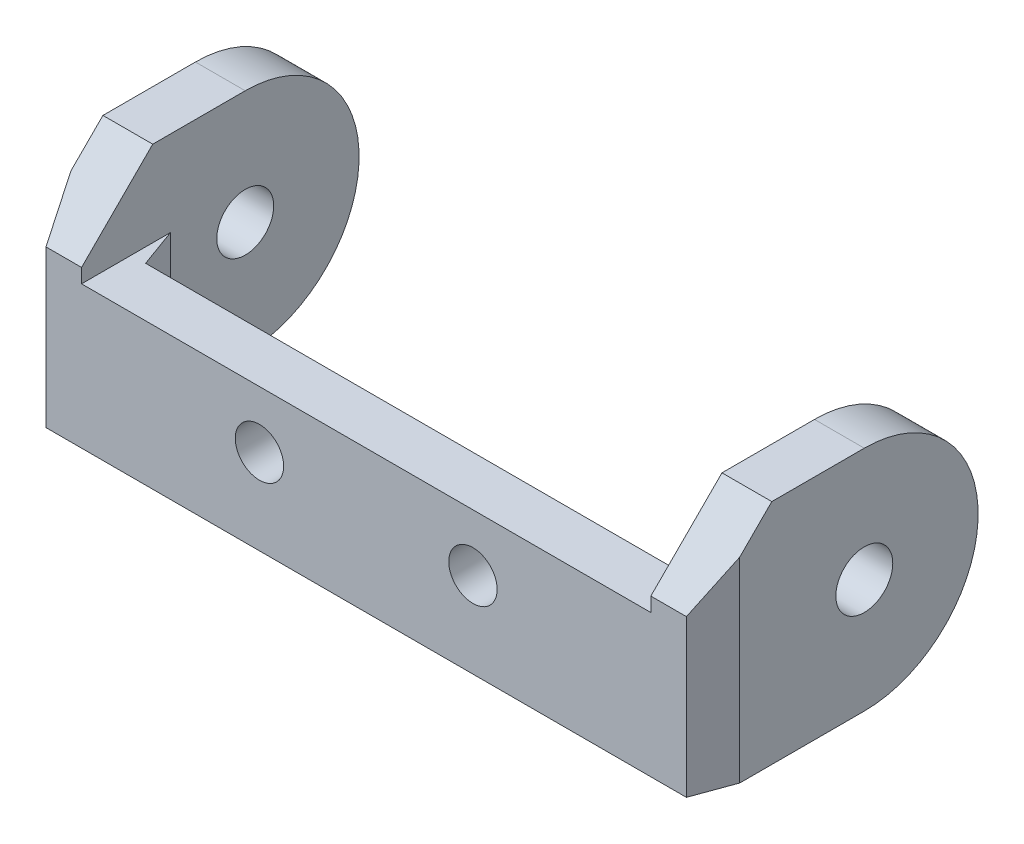
ISO-10303-21;
HEADER;
FILE_DESCRIPTION(('STEP AP214'),'2;1');
FILE_NAME('part.step','',(''),(''),'','','');
FILE_SCHEMA(('AUTOMOTIVE_DESIGN { 1 0 10303 214 1 1 1 1 }'));
ENDSEC;
DATA;
#1=APPLICATION_CONTEXT('core data for automotive mechanical design processes');
#2=APPLICATION_PROTOCOL_DEFINITION('international standard','automotive_design',2000,#1);
#3=PRODUCT_CONTEXT('',#1,'mechanical');
#4=PRODUCT('Part','Part','',(#3));
#5=PRODUCT_RELATED_PRODUCT_CATEGORY('part','',(#4));
#6=PRODUCT_DEFINITION_FORMATION('','',#4);
#7=PRODUCT_DEFINITION_CONTEXT('part definition',#1,'design');
#8=PRODUCT_DEFINITION('design','',#6,#7);
#9=PRODUCT_DEFINITION_SHAPE('','',#8);
#10=(LENGTH_UNIT() NAMED_UNIT(*) SI_UNIT(.MILLI.,.METRE.));
#11=(NAMED_UNIT(*) PLANE_ANGLE_UNIT() SI_UNIT($,.RADIAN.));
#12=(NAMED_UNIT(*) SI_UNIT($,.STERADIAN.) SOLID_ANGLE_UNIT());
#13=UNCERTAINTY_MEASURE_WITH_UNIT(LENGTH_MEASURE(1.E-05),#10,'distance_accuracy_value','');
#14=(GEOMETRIC_REPRESENTATION_CONTEXT(3) GLOBAL_UNCERTAINTY_ASSIGNED_CONTEXT((#13)) GLOBAL_UNIT_ASSIGNED_CONTEXT((#10,
#11,#12)) REPRESENTATION_CONTEXT('',''));
#15=CARTESIAN_POINT('',(0.,0.,0.));
#16=DIRECTION('',(0.,0.,1.));
#17=DIRECTION('',(1.,0.,0.));
#18=AXIS2_PLACEMENT_3D('',#15,#16,#17);
#19=CARTESIAN_POINT('',(27.5,1.00000000000001,3.5));
#20=DIRECTION('',(0.,-1.,0.));
#21=DIRECTION('',(1.,0.,0.));
#22=AXIS2_PLACEMENT_3D('',#19,#20,#21);
#23=PLANE('',#22);
#24=DIRECTION('',(0.,0.,1.));
#25=VECTOR('',#24,1.);
#26=CARTESIAN_POINT('',(24.,1.00000000000001,-8.));
#27=LINE('',#26,#25);
#28=CARTESIAN_POINT('',(24.,1.00000000000001,-8.));
#29=VERTEX_POINT('',#28);
#30=CARTESIAN_POINT('',(24.,1.00000000000001,-1.50000000000002));
#31=VERTEX_POINT('',#30);
#32=EDGE_CURVE('E220',#29,#31,#27,.T.);
#33=ORIENTED_EDGE('',*,*,#32,.T.);
#34=DIRECTION('',(1.,0.,0.));
#35=VECTOR('',#34,1.);
#36=CARTESIAN_POINT('',(26.5,1.00000000000001,-1.50000000000002));
#37=LINE('',#36,#35);
#38=CARTESIAN_POINT('',(27.5,1.00000000000001,-1.50000000000002));
#39=VERTEX_POINT('',#38);
#40=EDGE_CURVE('E289',#31,#39,#37,.T.);
#41=ORIENTED_EDGE('',*,*,#40,.T.);
#42=DIRECTION('',(0.,0.,-1.));
#43=VECTOR('',#42,1.);
#44=CARTESIAN_POINT('',(27.5,1.00000000000001,3.5));
#45=LINE('',#44,#43);
#46=CARTESIAN_POINT('',(27.5,1.00000000000001,-8.));
#47=VERTEX_POINT('',#46);
#48=EDGE_CURVE('E244',#39,#47,#45,.T.);
#49=ORIENTED_EDGE('',*,*,#48,.T.);
#50=DIRECTION('',(1.,0.,0.));
#51=VECTOR('',#50,1.);
#52=CARTESIAN_POINT('',(24.,1.00000000000001,-8.));
#53=LINE('',#52,#51);
#54=EDGE_CURVE('E231',#29,#47,#53,.T.);
#55=ORIENTED_EDGE('',*,*,#54,.F.);
#56=EDGE_LOOP('',(#33,#41,#49,#55));
#57=FACE_BOUND('',#56,.T.);
#58=ADVANCED_FACE('F34',(#57),#23,.F.);
#59=CARTESIAN_POINT('',(-19.5,-15.,3.5));
#60=DIRECTION('',(1.,0.,0.));
#61=DIRECTION('',(0.,0.,-1.));
#62=AXIS2_PLACEMENT_3D('',#59,#60,#61);
#63=PLANE('',#62);
#64=DIRECTION('',(0.,1.,0.));
#65=VECTOR('',#64,1.);
#66=CARTESIAN_POINT('',(-19.5,1.,0.752522580545379));
#67=LINE('',#66,#65);
#68=CARTESIAN_POINT('',(-19.5,-15.,0.752522580545379));
#69=VERTEX_POINT('',#68);
#70=CARTESIAN_POINT('',(-19.5,-1.25252258054538,0.752522580545379));
#71=VERTEX_POINT('',#70);
#72=EDGE_CURVE('E262',#69,#71,#67,.T.);
#73=ORIENTED_EDGE('',*,*,#72,.T.);
#74=DIRECTION('',(0.,0.707106781186547,-0.707106781186549));
#75=VECTOR('',#74,1.);
#76=CARTESIAN_POINT('',(-19.5,-3.99999999999999,3.5));
#77=LINE('',#76,#75);
#78=CARTESIAN_POINT('',(-19.5,1.,-1.50000000000001));
#79=VERTEX_POINT('',#78);
#80=EDGE_CURVE('E57',#71,#79,#77,.T.);
#81=ORIENTED_EDGE('',*,*,#80,.T.);
#82=DIRECTION('',(0.,0.,-1.));
#83=VECTOR('',#82,1.);
#84=CARTESIAN_POINT('',(-19.5,1.,3.5));
#85=LINE('',#84,#83);
#86=CARTESIAN_POINT('',(-19.5,1.00000000000001,-8.));
#87=VERTEX_POINT('',#86);
#88=EDGE_CURVE('E240',#79,#87,#85,.T.);
#89=ORIENTED_EDGE('',*,*,#88,.T.);
#90=CARTESIAN_POINT('',(-19.5,-6.99999999999999,-8.));
#91=DIRECTION('',(1.,0.,0.));
#92=DIRECTION('',(0.,0.,1.));
#93=AXIS2_PLACEMENT_3D('',#90,#91,#92);
#94=CIRCLE('',#93,8.);
#95=CARTESIAN_POINT('',(-19.5,-15.,-8.));
#96=VERTEX_POINT('',#95);
#97=EDGE_CURVE('E194',#96,#87,#94,.T.);
#98=ORIENTED_EDGE('',*,*,#97,.F.);
#99=DIRECTION('',(0.,0.,-1.));
#100=VECTOR('',#99,1.);
#101=CARTESIAN_POINT('',(-19.5,-15.,3.5));
#102=LINE('',#101,#100);
#103=EDGE_CURVE('E248',#69,#96,#102,.T.);
#104=ORIENTED_EDGE('',*,*,#103,.F.);
#105=EDGE_LOOP('',(#73,#81,#89,#98,#104));
#106=FACE_BOUND('',#105,.T.);
#107=CARTESIAN_POINT('',(-19.5,-6.99999999999999,-8.));
#108=DIRECTION('',(1.,0.,0.));
#109=DIRECTION('',(0.,0.,-1.));
#110=AXIS2_PLACEMENT_3D('',#107,#108,#109);
#111=CIRCLE('',#110,2.);
#112=CARTESIAN_POINT('',(-19.5,-6.99999999999999,-10.));
#113=VERTEX_POINT('',#112);
#114=EDGE_CURVE('E195',#113,#113,#111,.T.);
#115=ORIENTED_EDGE('',*,*,#114,.T.);
#116=EDGE_LOOP('',(#115));
#117=FACE_BOUND('',#116,.T.);
#118=ADVANCED_FACE('F304',(#106,#117),#63,.F.);
#119=CARTESIAN_POINT('',(27.5,-15.,3.5));
#120=DIRECTION('',(0.,1.,0.));
#121=DIRECTION('',(-1.,0.,0.));
#122=AXIS2_PLACEMENT_3D('',#119,#120,#121);
#123=PLANE('',#122);
#124=DIRECTION('',(1.,0.,0.));
#125=VECTOR('',#124,1.);
#126=CARTESIAN_POINT('',(27.5,-15.,3.5));
#127=LINE('',#126,#125);
#128=CARTESIAN_POINT('',(-18.5,-15.,3.5));
#129=VERTEX_POINT('',#128);
#130=CARTESIAN_POINT('',(26.5,-15.,3.5));
#131=VERTEX_POINT('',#130);
#132=EDGE_CURVE('E237',#129,#131,#127,.T.);
#133=ORIENTED_EDGE('',*,*,#132,.F.);
#134=DIRECTION('',(-0.34202014332567,0.,-0.939692620785908));
#135=VECTOR('',#134,1.);
#136=CARTESIAN_POINT('',(-18.5,-15.,3.5));
#137=LINE('',#136,#135);
#138=EDGE_CURVE('E260',#129,#69,#137,.T.);
#139=ORIENTED_EDGE('',*,*,#138,.T.);
#140=ORIENTED_EDGE('',*,*,#103,.T.);
#141=DIRECTION('',(-1.,0.,0.));
#142=VECTOR('',#141,1.);
#143=CARTESIAN_POINT('',(-16.,-15.,-8.));
#144=LINE('',#143,#142);
#145=CARTESIAN_POINT('',(-16.,-15.,-8.));
#146=VERTEX_POINT('',#145);
#147=EDGE_CURVE('E208',#146,#96,#144,.T.);
#148=ORIENTED_EDGE('',*,*,#147,.F.);
#149=DIRECTION('',(0.,0.,-1.));
#150=VECTOR('',#149,1.);
#151=CARTESIAN_POINT('',(-16.,-15.,0.));
#152=LINE('',#151,#150);
#153=CARTESIAN_POINT('',(-16.,-15.,-2.74747741945467));
#154=VERTEX_POINT('',#153);
#155=EDGE_CURVE('E203',#154,#146,#152,.T.);
#156=ORIENTED_EDGE('',*,*,#155,.F.);
#157=DIRECTION('',(0.342020143325663,0.,0.939692620785911));
#158=VECTOR('',#157,1.);
#159=CARTESIAN_POINT('',(-8.90356609932702,-15.,16.749814481297));
#160=LINE('',#159,#158);
#161=CARTESIAN_POINT('',(-15.,-15.,0.));
#162=VERTEX_POINT('',#161);
#163=EDGE_CURVE('E280',#154,#162,#160,.T.);
#164=ORIENTED_EDGE('',*,*,#163,.T.);
#165=DIRECTION('',(1.,0.,0.));
#166=VECTOR('',#165,1.);
#167=CARTESIAN_POINT('',(27.5,-15.,0.));
#168=LINE('',#167,#166);
#169=CARTESIAN_POINT('',(23.,-15.,0.));
#170=VERTEX_POINT('',#169);
#171=EDGE_CURVE('E234',#162,#170,#168,.T.);
#172=ORIENTED_EDGE('',*,*,#171,.T.);
#173=DIRECTION('',(0.342020143325663,0.,-0.939692620785911));
#174=VECTOR('',#173,1.);
#175=CARTESIAN_POINT('',(22.4015216860309,-15.,1.64430565366354));
#176=LINE('',#175,#174);
#177=CARTESIAN_POINT('',(24.,-15.,-2.74747741945467));
#178=VERTEX_POINT('',#177);
#179=EDGE_CURVE('E276',#170,#178,#176,.T.);
#180=ORIENTED_EDGE('',*,*,#179,.T.);
#181=DIRECTION('',(0.,0.,-1.));
#182=VECTOR('',#181,1.);
#183=CARTESIAN_POINT('',(24.,-15.,0.));
#184=LINE('',#183,#182);
#185=CARTESIAN_POINT('',(24.,-15.,-8.));
#186=VERTEX_POINT('',#185);
#187=EDGE_CURVE('E223',#178,#186,#184,.T.);
#188=ORIENTED_EDGE('',*,*,#187,.T.);
#189=DIRECTION('',(1.,0.,0.));
#190=VECTOR('',#189,1.);
#191=CARTESIAN_POINT('',(24.,-15.,-8.));
#192=LINE('',#191,#190);
#193=CARTESIAN_POINT('',(27.5,-15.,-8.));
#194=VERTEX_POINT('',#193);
#195=EDGE_CURVE('E228',#186,#194,#192,.T.);
#196=ORIENTED_EDGE('',*,*,#195,.T.);
#197=DIRECTION('',(0.,0.,-1.));
#198=VECTOR('',#197,1.);
#199=CARTESIAN_POINT('',(27.5,-15.,3.5));
#200=LINE('',#199,#198);
#201=CARTESIAN_POINT('',(27.5,-15.,0.752522580545379));
#202=VERTEX_POINT('',#201);
#203=EDGE_CURVE('E246',#202,#194,#200,.T.);
#204=ORIENTED_EDGE('',*,*,#203,.F.);
#205=DIRECTION('',(-0.34202014332567,0.,0.939692620785908));
#206=VECTOR('',#205,1.);
#207=CARTESIAN_POINT('',(26.5,-15.,3.5));
#208=LINE('',#207,#206);
#209=EDGE_CURVE('E258',#202,#131,#208,.T.);
#210=ORIENTED_EDGE('',*,*,#209,.T.);
#211=EDGE_LOOP('',(#133,#139,#140,#148,#156,#164,#172,#180,#188,#196,#204,#210));
#212=FACE_BOUND('',#211,.T.);
#213=ADVANCED_FACE('F310',(#212),#123,.F.);
#214=CARTESIAN_POINT('',(27.5,-15.,3.5));
#215=DIRECTION('',(-1.,0.,0.));
#216=DIRECTION('',(0.,0.,1.));
#217=AXIS2_PLACEMENT_3D('',#214,#215,#216);
#218=PLANE('',#217);
#219=ORIENTED_EDGE('',*,*,#48,.F.);
#220=DIRECTION('',(0.,-0.707106781186547,0.707106781186549));
#221=VECTOR('',#220,1.);
#222=CARTESIAN_POINT('',(27.5,-4.,3.5));
#223=LINE('',#222,#221);
#224=CARTESIAN_POINT('',(27.5,-1.25252258054538,0.752522580545379));
#225=VERTEX_POINT('',#224);
#226=EDGE_CURVE('E291',#39,#225,#223,.T.);
#227=ORIENTED_EDGE('',*,*,#226,.T.);
#228=DIRECTION('',(0.,-1.,0.));
#229=VECTOR('',#228,1.);
#230=CARTESIAN_POINT('',(27.5,-15.,0.752522580545379));
#231=LINE('',#230,#229);
#232=EDGE_CURVE('E264',#225,#202,#231,.T.);
#233=ORIENTED_EDGE('',*,*,#232,.T.);
#234=ORIENTED_EDGE('',*,*,#203,.T.);
#235=CARTESIAN_POINT('',(27.5,-6.99999999999999,-8.));
#236=DIRECTION('',(1.,0.,0.));
#237=DIRECTION('',(0.,0.,1.));
#238=AXIS2_PLACEMENT_3D('',#235,#236,#237);
#239=CIRCLE('',#238,8.);
#240=EDGE_CURVE('E217',#194,#47,#239,.T.);
#241=ORIENTED_EDGE('',*,*,#240,.T.);
#242=EDGE_LOOP('',(#219,#227,#233,#234,#241));
#243=FACE_BOUND('',#242,.T.);
#244=CARTESIAN_POINT('',(27.5,-6.99999999999999,-8.));
#245=DIRECTION('',(1.,0.,0.));
#246=DIRECTION('',(0.,0.,-1.));
#247=AXIS2_PLACEMENT_3D('',#244,#245,#246);
#248=CIRCLE('',#247,2.);
#249=CARTESIAN_POINT('',(27.5,-6.99999999999999,-10.));
#250=VERTEX_POINT('',#249);
#251=EDGE_CURVE('E211',#250,#250,#248,.T.);
#252=ORIENTED_EDGE('',*,*,#251,.F.);
#253=EDGE_LOOP('',(#252));
#254=FACE_BOUND('',#253,.T.);
#255=ADVANCED_FACE('F334',(#243,#254),#218,.F.);
#256=ORIENTED_EDGE('',*,*,#88,.F.);
#257=DIRECTION('',(1.,0.,0.));
#258=VECTOR('',#257,1.);
#259=CARTESIAN_POINT('',(-16.,1.,-1.50000000000001));
#260=LINE('',#259,#258);
#261=CARTESIAN_POINT('',(-16.,1.00000000000001,-1.50000000000001));
#262=VERTEX_POINT('',#261);
#263=EDGE_CURVE('E43',#79,#262,#260,.T.);
#264=ORIENTED_EDGE('',*,*,#263,.T.);
#265=DIRECTION('',(0.,0.,1.));
#266=VECTOR('',#265,1.);
#267=CARTESIAN_POINT('',(-16.,1.00000000000001,-8.));
#268=LINE('',#267,#266);
#269=CARTESIAN_POINT('',(-16.,1.00000000000001,-8.));
#270=VERTEX_POINT('',#269);
#271=EDGE_CURVE('E199',#270,#262,#268,.T.);
#272=ORIENTED_EDGE('',*,*,#271,.F.);
#273=DIRECTION('',(-1.,0.,0.));
#274=VECTOR('',#273,1.);
#275=CARTESIAN_POINT('',(-16.,1.00000000000001,-8.));
#276=LINE('',#275,#274);
#277=EDGE_CURVE('E205',#270,#87,#276,.T.);
#278=ORIENTED_EDGE('',*,*,#277,.T.);
#279=EDGE_LOOP('',(#256,#264,#272,#278));
#280=FACE_BOUND('',#279,.T.);
#281=ADVANCED_FACE('F354',(#280),#23,.F.);
#282=CARTESIAN_POINT('',(0.,0.,3.5));
#283=DIRECTION('',(0.,0.,1.));
#284=DIRECTION('',(1.,0.,0.));
#285=AXIS2_PLACEMENT_3D('',#282,#283,#284);
#286=PLANE('',#285);
#287=DIRECTION('',(0.,1.,0.));
#288=VECTOR('',#287,1.);
#289=CARTESIAN_POINT('',(26.5,1.00000000000001,3.5));
#290=LINE('',#289,#288);
#291=CARTESIAN_POINT('',(26.5,-4.,3.5));
#292=VERTEX_POINT('',#291);
#293=EDGE_CURVE('E250',#131,#292,#290,.T.);
#294=ORIENTED_EDGE('',*,*,#293,.T.);
#295=DIRECTION('',(-1.,0.,0.));
#296=VECTOR('',#295,1.);
#297=CARTESIAN_POINT('',(24.,-4.,3.5));
#298=LINE('',#297,#296);
#299=CARTESIAN_POINT('',(24.,-4.,3.5));
#300=VERTEX_POINT('',#299);
#301=EDGE_CURVE('E285',#292,#300,#298,.T.);
#302=ORIENTED_EDGE('',*,*,#301,.T.);
#303=DIRECTION('',(0.,1.,0.));
#304=VECTOR('',#303,1.);
#305=CARTESIAN_POINT('',(24.,1.00000000000001,3.5));
#306=LINE('',#305,#304);
#307=CARTESIAN_POINT('',(24.,-4.99999999999999,3.5));
#308=VERTEX_POINT('',#307);
#309=EDGE_CURVE('E160',#308,#300,#306,.T.);
#310=ORIENTED_EDGE('',*,*,#309,.F.);
#311=DIRECTION('',(1.,0.,0.));
#312=VECTOR('',#311,1.);
#313=CARTESIAN_POINT('',(24.,-4.99999999999999,3.5));
#314=LINE('',#313,#312);
#315=CARTESIAN_POINT('',(-16.,-5.,3.5));
#316=VERTEX_POINT('',#315);
#317=EDGE_CURVE('E159',#316,#308,#314,.T.);
#318=ORIENTED_EDGE('',*,*,#317,.F.);
#319=DIRECTION('',(0.,-1.,0.));
#320=VECTOR('',#319,1.);
#321=CARTESIAN_POINT('',(-16.,1.,3.5));
#322=LINE('',#321,#320);
#323=CARTESIAN_POINT('',(-16.,-3.99999999999999,3.5));
#324=VERTEX_POINT('',#323);
#325=EDGE_CURVE('E147',#324,#316,#322,.T.);
#326=ORIENTED_EDGE('',*,*,#325,.F.);
#327=DIRECTION('',(-1.,0.,0.));
#328=VECTOR('',#327,1.);
#329=CARTESIAN_POINT('',(-18.5,-4.,3.5));
#330=LINE('',#329,#328);
#331=CARTESIAN_POINT('',(-18.5,-3.99999999999999,3.5));
#332=VERTEX_POINT('',#331);
#333=EDGE_CURVE('E283',#324,#332,#330,.T.);
#334=ORIENTED_EDGE('',*,*,#333,.T.);
#335=DIRECTION('',(0.,-1.,0.));
#336=VECTOR('',#335,1.);
#337=CARTESIAN_POINT('',(-18.5,-15.,3.5));
#338=LINE('',#337,#336);
#339=EDGE_CURVE('E256',#332,#129,#338,.T.);
#340=ORIENTED_EDGE('',*,*,#339,.T.);
#341=ORIENTED_EDGE('',*,*,#132,.T.);
#342=EDGE_LOOP('',(#294,#302,#310,#318,#326,#334,#340,#341));
#343=FACE_BOUND('',#342,.T.);
#344=CARTESIAN_POINT('',(11.5,-9.,3.5));
#345=DIRECTION('',(0.,0.,1.));
#346=DIRECTION('',(-1.,0.,0.));
#347=AXIS2_PLACEMENT_3D('',#344,#345,#346);
#348=CIRCLE('',#347,1.7);
#349=CARTESIAN_POINT('',(9.80000000000001,-9.,3.5));
#350=VERTEX_POINT('',#349);
#351=EDGE_CURVE('E185',#350,#350,#348,.T.);
#352=ORIENTED_EDGE('',*,*,#351,.F.);
#353=EDGE_LOOP('',(#352));
#354=FACE_BOUND('',#353,.T.);
#355=CARTESIAN_POINT('',(-3.49999999999999,-9.,3.5));
#356=DIRECTION('',(0.,0.,1.));
#357=DIRECTION('',(1.,0.,0.));
#358=AXIS2_PLACEMENT_3D('',#355,#356,#357);
#359=CIRCLE('',#358,1.7);
#360=CARTESIAN_POINT('',(-1.79999999999999,-9.,3.5));
#361=VERTEX_POINT('',#360);
#362=EDGE_CURVE('E184',#361,#361,#359,.T.);
#363=ORIENTED_EDGE('',*,*,#362,.F.);
#364=EDGE_LOOP('',(#363));
#365=FACE_BOUND('',#364,.T.);
#366=ADVANCED_FACE('F173',(#343,#354,#365),#286,.T.);
#367=CARTESIAN_POINT('',(0.,0.,0.));
#368=DIRECTION('',(0.,0.,1.));
#369=DIRECTION('',(1.,0.,0.));
#370=AXIS2_PLACEMENT_3D('',#367,#368,#369);
#371=PLANE('',#370);
#372=CARTESIAN_POINT('',(11.5,-9.,0.));
#373=DIRECTION('',(0.,0.,1.));
#374=DIRECTION('',(1.,0.,0.));
#375=AXIS2_PLACEMENT_3D('',#372,#373,#374);
#376=CIRCLE('',#375,1.7);
#377=CARTESIAN_POINT('',(13.2,-9.,0.));
#378=VERTEX_POINT('',#377);
#379=EDGE_CURVE('E198',#378,#378,#376,.T.);
#380=ORIENTED_EDGE('',*,*,#379,.T.);
#381=EDGE_LOOP('',(#380));
#382=FACE_BOUND('',#381,.T.);
#383=CARTESIAN_POINT('',(-3.49999999999999,-9.,0.));
#384=DIRECTION('',(0.,0.,1.));
#385=DIRECTION('',(1.,0.,0.));
#386=AXIS2_PLACEMENT_3D('',#383,#384,#385);
#387=CIRCLE('',#386,1.7);
#388=CARTESIAN_POINT('',(-1.79999999999999,-9.,0.));
#389=VERTEX_POINT('',#388);
#390=EDGE_CURVE('E188',#389,#389,#387,.T.);
#391=ORIENTED_EDGE('',*,*,#390,.T.);
#392=EDGE_LOOP('',(#391));
#393=FACE_BOUND('',#392,.T.);
#394=DIRECTION('',(1.,0.,0.));
#395=VECTOR('',#394,1.);
#396=CARTESIAN_POINT('',(0.,-5.,0.));
#397=LINE('',#396,#395);
#398=CARTESIAN_POINT('',(-15.,-5.,0.));
#399=VERTEX_POINT('',#398);
#400=CARTESIAN_POINT('',(23.,-4.99999999999999,0.));
#401=VERTEX_POINT('',#400);
#402=EDGE_CURVE('E180',#399,#401,#397,.T.);
#403=ORIENTED_EDGE('',*,*,#402,.T.);
#404=DIRECTION('',(0.,-1.,0.));
#405=VECTOR('',#404,1.);
#406=CARTESIAN_POINT('',(23.,0.,0.));
#407=LINE('',#406,#405);
#408=EDGE_CURVE('E268',#401,#170,#407,.T.);
#409=ORIENTED_EDGE('',*,*,#408,.T.);
#410=ORIENTED_EDGE('',*,*,#171,.F.);
#411=DIRECTION('',(0.,1.,0.));
#412=VECTOR('',#411,1.);
#413=CARTESIAN_POINT('',(-15.,0.,0.));
#414=LINE('',#413,#412);
#415=EDGE_CURVE('E266',#162,#399,#414,.T.);
#416=ORIENTED_EDGE('',*,*,#415,.T.);
#417=EDGE_LOOP('',(#403,#409,#410,#416));
#418=FACE_BOUND('',#417,.T.);
#419=ADVANCED_FACE('F343',(#382,#393,#418),#371,.F.);
#420=CARTESIAN_POINT('',(24.,-6.99999999999999,-8.));
#421=DIRECTION('',(1.,0.,0.));
#422=DIRECTION('',(0.,0.,-1.));
#423=AXIS2_PLACEMENT_3D('',#420,#421,#422);
#424=CYLINDRICAL_SURFACE('',#423,8.);
#425=ORIENTED_EDGE('',*,*,#240,.F.);
#426=ORIENTED_EDGE('',*,*,#195,.F.);
#427=CARTESIAN_POINT('',(24.,-6.99999999999999,-8.));
#428=DIRECTION('',(1.,0.,0.));
#429=DIRECTION('',(0.,0.,1.));
#430=AXIS2_PLACEMENT_3D('',#427,#428,#429);
#431=CIRCLE('',#430,8.);
#432=EDGE_CURVE('E225',#186,#29,#431,.T.);
#433=ORIENTED_EDGE('',*,*,#432,.T.);
#434=ORIENTED_EDGE('',*,*,#54,.T.);
#435=EDGE_LOOP('',(#425,#426,#433,#434));
#436=FACE_BOUND('',#435,.T.);
#437=ADVANCED_FACE('F331',(#436),#424,.T.);
#438=CARTESIAN_POINT('',(24.,-6.99999999999999,-8.));
#439=DIRECTION('',(-1.,0.,0.));
#440=DIRECTION('',(0.,0.,1.));
#441=AXIS2_PLACEMENT_3D('',#438,#439,#440);
#442=PLANE('',#441);
#443=ORIENTED_EDGE('',*,*,#309,.T.);
#444=DIRECTION('',(0.,0.707106781186547,-0.707106781186549));
#445=VECTOR('',#444,1.);
#446=CARTESIAN_POINT('',(24.,0.250000000000011,-0.750000000000019));
#447=LINE('',#446,#445);
#448=EDGE_CURVE('E287',#300,#31,#447,.T.);
#449=ORIENTED_EDGE('',*,*,#448,.T.);
#450=ORIENTED_EDGE('',*,*,#32,.F.);
#451=ORIENTED_EDGE('',*,*,#432,.F.);
#452=ORIENTED_EDGE('',*,*,#187,.F.);
#453=DIRECTION('',(0.,1.,0.));
#454=VECTOR('',#453,1.);
#455=CARTESIAN_POINT('',(24.,-6.99999999999999,-2.74747741945467));
#456=LINE('',#455,#454);
#457=CARTESIAN_POINT('',(24.,-4.99999999999999,-2.74747741945467));
#458=VERTEX_POINT('',#457);
#459=EDGE_CURVE('E271',#178,#458,#456,.T.);
#460=ORIENTED_EDGE('',*,*,#459,.T.);
#461=DIRECTION('',(0.,0.,1.));
#462=VECTOR('',#461,1.);
#463=CARTESIAN_POINT('',(24.,-4.99999999999999,-6.5));
#464=LINE('',#463,#462);
#465=EDGE_CURVE('E170',#458,#308,#464,.T.);
#466=ORIENTED_EDGE('',*,*,#465,.T.);
#467=EDGE_LOOP('',(#443,#449,#450,#451,#452,#460,#466));
#468=FACE_BOUND('',#467,.T.);
#469=CARTESIAN_POINT('',(24.,-6.99999999999999,-8.));
#470=DIRECTION('',(1.,0.,0.));
#471=DIRECTION('',(0.,0.,-1.));
#472=AXIS2_PLACEMENT_3D('',#469,#470,#471);
#473=CIRCLE('',#472,2.);
#474=CARTESIAN_POINT('',(24.,-6.99999999999999,-10.));
#475=VERTEX_POINT('',#474);
#476=EDGE_CURVE('E214',#475,#475,#473,.T.);
#477=ORIENTED_EDGE('',*,*,#476,.T.);
#478=EDGE_LOOP('',(#477));
#479=FACE_BOUND('',#478,.T.);
#480=ADVANCED_FACE('F324',(#468,#479),#442,.T.);
#481=CARTESIAN_POINT('',(24.,-6.99999999999999,-8.));
#482=DIRECTION('',(1.,0.,0.));
#483=DIRECTION('',(0.,0.,-1.));
#484=AXIS2_PLACEMENT_3D('',#481,#482,#483);
#485=CYLINDRICAL_SURFACE('',#484,2.);
#486=ORIENTED_EDGE('',*,*,#476,.F.);
#487=EDGE_LOOP('',(#486));
#488=FACE_BOUND('',#487,.T.);
#489=ORIENTED_EDGE('',*,*,#251,.T.);
#490=EDGE_LOOP('',(#489));
#491=FACE_BOUND('',#490,.T.);
#492=ADVANCED_FACE('F431',(#488,#491),#485,.F.);
#493=CARTESIAN_POINT('',(-16.,-6.99999999999999,-8.));
#494=DIRECTION('',(1.,0.,0.));
#495=DIRECTION('',(0.,0.,1.));
#496=AXIS2_PLACEMENT_3D('',#493,#494,#495);
#497=PLANE('',#496);
#498=ORIENTED_EDGE('',*,*,#271,.T.);
#499=DIRECTION('',(0.,-0.707106781186547,0.707106781186549));
#500=VECTOR('',#499,1.);
#501=CARTESIAN_POINT('',(-16.,0.25000000000001,-0.750000000000018));
#502=LINE('',#501,#500);
#503=EDGE_CURVE('E11',#262,#324,#502,.T.);
#504=ORIENTED_EDGE('',*,*,#503,.T.);
#505=ORIENTED_EDGE('',*,*,#325,.T.);
#506=DIRECTION('',(0.,0.,1.));
#507=VECTOR('',#506,1.);
#508=CARTESIAN_POINT('',(-16.,-5.,-6.5));
#509=LINE('',#508,#507);
#510=CARTESIAN_POINT('',(-16.,-5.,-2.74747741945467));
#511=VERTEX_POINT('',#510);
#512=EDGE_CURVE('E152',#511,#316,#509,.T.);
#513=ORIENTED_EDGE('',*,*,#512,.F.);
#514=DIRECTION('',(0.,-1.,0.));
#515=VECTOR('',#514,1.);
#516=CARTESIAN_POINT('',(-16.,-6.99999999999999,-2.74747741945467));
#517=LINE('',#516,#515);
#518=EDGE_CURVE('E274',#511,#154,#517,.T.);
#519=ORIENTED_EDGE('',*,*,#518,.T.);
#520=ORIENTED_EDGE('',*,*,#155,.T.);
#521=CARTESIAN_POINT('',(-16.,-6.99999999999999,-8.));
#522=DIRECTION('',(1.,0.,0.));
#523=DIRECTION('',(0.,0.,1.));
#524=AXIS2_PLACEMENT_3D('',#521,#522,#523);
#525=CIRCLE('',#524,8.);
#526=EDGE_CURVE('E201',#146,#270,#525,.T.);
#527=ORIENTED_EDGE('',*,*,#526,.T.);
#528=EDGE_LOOP('',(#498,#504,#505,#513,#519,#520,#527));
#529=FACE_BOUND('',#528,.T.);
#530=CARTESIAN_POINT('',(-16.,-6.99999999999999,-8.));
#531=DIRECTION('',(1.,0.,0.));
#532=DIRECTION('',(0.,0.,-1.));
#533=AXIS2_PLACEMENT_3D('',#530,#531,#532);
#534=CIRCLE('',#533,2.);
#535=CARTESIAN_POINT('',(-16.,-6.99999999999999,-10.));
#536=VERTEX_POINT('',#535);
#537=EDGE_CURVE('E191',#536,#536,#534,.T.);
#538=ORIENTED_EDGE('',*,*,#537,.F.);
#539=EDGE_LOOP('',(#538));
#540=FACE_BOUND('',#539,.T.);
#541=ADVANCED_FACE('F149',(#529,#540),#497,.T.);
#542=CARTESIAN_POINT('',(-16.,-6.99999999999999,-8.));
#543=DIRECTION('',(-1.,0.,0.));
#544=DIRECTION('',(0.,-1.,0.));
#545=AXIS2_PLACEMENT_3D('',#542,#543,#544);
#546=CYLINDRICAL_SURFACE('',#545,8.);
#547=ORIENTED_EDGE('',*,*,#97,.T.);
#548=ORIENTED_EDGE('',*,*,#277,.F.);
#549=ORIENTED_EDGE('',*,*,#526,.F.);
#550=ORIENTED_EDGE('',*,*,#147,.T.);
#551=EDGE_LOOP('',(#547,#548,#549,#550));
#552=FACE_BOUND('',#551,.T.);
#553=ADVANCED_FACE('F353',(#552),#546,.T.);
#554=CARTESIAN_POINT('',(-16.,-6.99999999999999,-8.));
#555=DIRECTION('',(-1.,0.,0.));
#556=DIRECTION('',(0.,-1.,0.));
#557=AXIS2_PLACEMENT_3D('',#554,#555,#556);
#558=CYLINDRICAL_SURFACE('',#557,2.);
#559=ORIENTED_EDGE('',*,*,#537,.T.);
#560=EDGE_LOOP('',(#559));
#561=FACE_BOUND('',#560,.T.);
#562=ORIENTED_EDGE('',*,*,#114,.F.);
#563=EDGE_LOOP('',(#562));
#564=FACE_BOUND('',#563,.T.);
#565=ADVANCED_FACE('F526',(#561,#564),#558,.F.);
#566=CARTESIAN_POINT('',(-3.49999999999999,-9.,-6.5));
#567=DIRECTION('',(0.,0.,1.));
#568=DIRECTION('',(1.,0.,0.));
#569=AXIS2_PLACEMENT_3D('',#566,#567,#568);
#570=CYLINDRICAL_SURFACE('',#569,1.7);
#571=ORIENTED_EDGE('',*,*,#362,.T.);
#572=EDGE_LOOP('',(#571));
#573=FACE_BOUND('',#572,.T.);
#574=ORIENTED_EDGE('',*,*,#390,.F.);
#575=EDGE_LOOP('',(#574));
#576=FACE_BOUND('',#575,.T.);
#577=ADVANCED_FACE('F515',(#573,#576),#570,.F.);
#578=CARTESIAN_POINT('',(11.5,-9.,-6.5));
#579=DIRECTION('',(0.,0.,1.));
#580=DIRECTION('',(1.,0.,0.));
#581=AXIS2_PLACEMENT_3D('',#578,#579,#580);
#582=CYLINDRICAL_SURFACE('',#581,1.7);
#583=ORIENTED_EDGE('',*,*,#351,.T.);
#584=EDGE_LOOP('',(#583));
#585=FACE_BOUND('',#584,.T.);
#586=ORIENTED_EDGE('',*,*,#379,.F.);
#587=EDGE_LOOP('',(#586));
#588=FACE_BOUND('',#587,.T.);
#589=ADVANCED_FACE('F495',(#585,#588),#582,.F.);
#590=CARTESIAN_POINT('',(24.,-4.99999999999999,-6.5));
#591=DIRECTION('',(0.,-1.,0.));
#592=DIRECTION('',(1.,0.,0.));
#593=AXIS2_PLACEMENT_3D('',#590,#591,#592);
#594=PLANE('',#593);
#595=ORIENTED_EDGE('',*,*,#512,.T.);
#596=ORIENTED_EDGE('',*,*,#317,.T.);
#597=ORIENTED_EDGE('',*,*,#465,.F.);
#598=DIRECTION('',(-0.342020143325663,0.,0.939692620785911));
#599=VECTOR('',#598,1.);
#600=CARTESIAN_POINT('',(25.2060375099217,-4.99999999999999,-6.06103824497997));
#601=LINE('',#600,#599);
#602=EDGE_CURVE('E278',#458,#401,#601,.T.);
#603=ORIENTED_EDGE('',*,*,#602,.T.);
#604=ORIENTED_EDGE('',*,*,#402,.F.);
#605=DIRECTION('',(-0.342020143325663,0.,-0.939692620785911));
#606=VECTOR('',#605,1.);
#607=CARTESIAN_POINT('',(-12.5269263723014,-5.,6.79471394875063));
#608=LINE('',#607,#606);
#609=EDGE_CURVE('E168',#399,#511,#608,.T.);
#610=ORIENTED_EDGE('',*,*,#609,.T.);
#611=EDGE_LOOP('',(#595,#596,#597,#603,#604,#610));
#612=FACE_BOUND('',#611,.T.);
#613=ADVANCED_FACE('F164',(#612),#594,.F.);
#614=CARTESIAN_POINT('',(-18.5,0.,3.5));
#615=DIRECTION('',(-0.939692620785908,0.,0.34202014332567));
#616=DIRECTION('',(0.,1.,0.));
#617=AXIS2_PLACEMENT_3D('',#614,#615,#616);
#618=PLANE('',#617);
#619=ORIENTED_EDGE('',*,*,#339,.F.);
#620=DIRECTION('',(-0.249243569363956,0.684791078771735,-0.684791078771737));
#621=VECTOR('',#620,1.);
#622=CARTESIAN_POINT('',(-19.1827190909666,-2.12424471373857,1.62424471373857));
#623=LINE('',#622,#621);
#624=EDGE_CURVE('E295',#332,#71,#623,.T.);
#625=ORIENTED_EDGE('',*,*,#624,.T.);
#626=ORIENTED_EDGE('',*,*,#72,.F.);
#627=ORIENTED_EDGE('',*,*,#138,.F.);
#628=EDGE_LOOP('',(#619,#625,#626,#627));
#629=FACE_BOUND('',#628,.T.);
#630=ADVANCED_FACE('F300',(#629),#618,.T.);
#631=CARTESIAN_POINT('',(26.5,0.,3.5));
#632=DIRECTION('',(0.939692620785908,0.,0.34202014332567));
#633=DIRECTION('',(0.,-1.,0.));
#634=AXIS2_PLACEMENT_3D('',#631,#632,#633);
#635=PLANE('',#634);
#636=ORIENTED_EDGE('',*,*,#232,.F.);
#637=DIRECTION('',(-0.249243569363956,-0.684791078771735,0.684791078771737));
#638=VECTOR('',#637,1.);
#639=CARTESIAN_POINT('',(27.1827190909666,-2.12424471373857,1.62424471373857));
#640=LINE('',#639,#638);
#641=EDGE_CURVE('E293',#225,#292,#640,.T.);
#642=ORIENTED_EDGE('',*,*,#641,.T.);
#643=ORIENTED_EDGE('',*,*,#293,.F.);
#644=ORIENTED_EDGE('',*,*,#209,.F.);
#645=EDGE_LOOP('',(#636,#642,#643,#644));
#646=FACE_BOUND('',#645,.T.);
#647=ADVANCED_FACE('F315',(#646),#635,.T.);
#648=CARTESIAN_POINT('',(23.,0.,0.));
#649=DIRECTION('',(0.939692620785911,0.,0.342020143325663));
#650=DIRECTION('',(0.,-1.,0.));
#651=AXIS2_PLACEMENT_3D('',#648,#649,#650);
#652=PLANE('',#651);
#653=ORIENTED_EDGE('',*,*,#602,.F.);
#654=ORIENTED_EDGE('',*,*,#459,.F.);
#655=ORIENTED_EDGE('',*,*,#179,.F.);
#656=ORIENTED_EDGE('',*,*,#408,.F.);
#657=EDGE_LOOP('',(#653,#654,#655,#656));
#658=FACE_BOUND('',#657,.T.);
#659=ADVANCED_FACE('F340',(#658),#652,.F.);
#660=CARTESIAN_POINT('',(-16.,-6.99999999999999,-2.74747741945467));
#661=DIRECTION('',(-0.93969262078591,0.,0.342020143325663));
#662=DIRECTION('',(0.,-1.,0.));
#663=AXIS2_PLACEMENT_3D('',#660,#661,#662);
#664=PLANE('',#663);
#665=ORIENTED_EDGE('',*,*,#609,.F.);
#666=ORIENTED_EDGE('',*,*,#415,.F.);
#667=ORIENTED_EDGE('',*,*,#163,.F.);
#668=ORIENTED_EDGE('',*,*,#518,.F.);
#669=EDGE_LOOP('',(#665,#666,#667,#668));
#670=FACE_BOUND('',#669,.T.);
#671=ADVANCED_FACE('F347',(#670),#664,.F.);
#672=CARTESIAN_POINT('',(0.,-4.,3.5));
#673=DIRECTION('',(0.,0.707106781186549,0.707106781186547));
#674=DIRECTION('',(1.,0.,0.));
#675=AXIS2_PLACEMENT_3D('',#672,#673,#674);
#676=PLANE('',#675);
#677=ORIENTED_EDGE('',*,*,#226,.F.);
#678=ORIENTED_EDGE('',*,*,#40,.F.);
#679=ORIENTED_EDGE('',*,*,#448,.F.);
#680=ORIENTED_EDGE('',*,*,#301,.F.);
#681=ORIENTED_EDGE('',*,*,#641,.F.);
#682=EDGE_LOOP('',(#677,#678,#679,#680,#681));
#683=FACE_BOUND('',#682,.T.);
#684=ADVANCED_FACE('F320',(#683),#676,.T.);
#685=CARTESIAN_POINT('',(0.,-3.99999999999999,3.5));
#686=DIRECTION('',(0.,0.707106781186548,0.707106781186546));
#687=DIRECTION('',(1.,0.,0.));
#688=AXIS2_PLACEMENT_3D('',#685,#686,#687);
#689=PLANE('',#688);
#690=ORIENTED_EDGE('',*,*,#503,.F.);
#691=ORIENTED_EDGE('',*,*,#263,.F.);
#692=ORIENTED_EDGE('',*,*,#80,.F.);
#693=ORIENTED_EDGE('',*,*,#624,.F.);
#694=ORIENTED_EDGE('',*,*,#333,.F.);
#695=EDGE_LOOP('',(#690,#691,#692,#693,#694));
#696=FACE_BOUND('',#695,.T.);
#697=ADVANCED_FACE('F37',(#696),#689,.T.);
#698=CLOSED_SHELL('',(#58,#118,#213,#255,#281,#366,#419,#437,#480,#492,#541,#553,#565,#577,#589,
#613,#630,#647,#659,#671,#684,#697));
#699=MANIFOLD_SOLID_BREP('B2',#698);
#700=ADVANCED_BREP_SHAPE_REPRESENTATION('',(#18,#699),#14);
#701=SHAPE_DEFINITION_REPRESENTATION(#9,#700);
ENDSEC;
END-ISO-10303-21;
